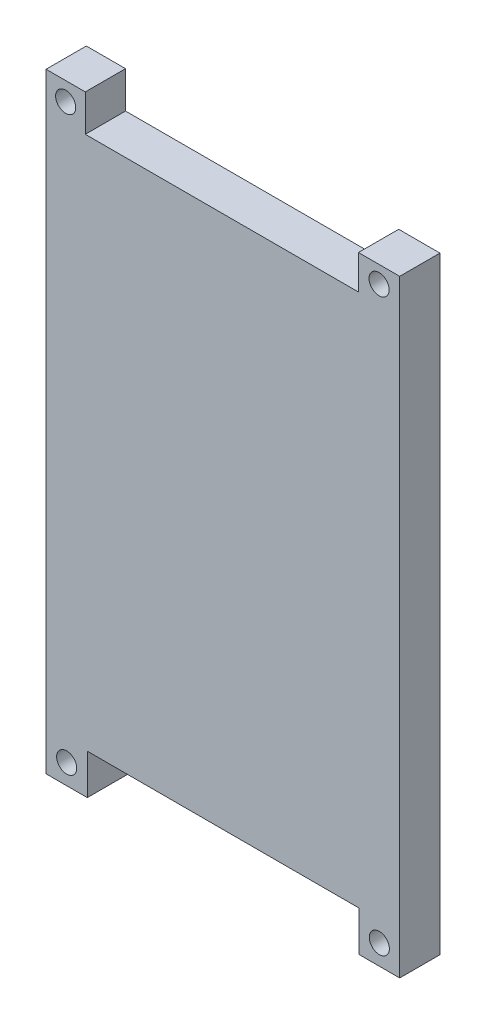
ISO-10303-21;
HEADER;
FILE_DESCRIPTION(('STEP AP214'),'2;1');
FILE_NAME('part.step','',(''),(''),'','','');
FILE_SCHEMA(('AUTOMOTIVE_DESIGN { 1 0 10303 214 1 1 1 1 }'));
ENDSEC;
DATA;
#1=APPLICATION_CONTEXT('core data for automotive mechanical design processes');
#2=APPLICATION_PROTOCOL_DEFINITION('international standard','automotive_design',2000,#1);
#3=PRODUCT_CONTEXT('',#1,'mechanical');
#4=PRODUCT('Part','Part','',(#3));
#5=PRODUCT_RELATED_PRODUCT_CATEGORY('part','',(#4));
#6=PRODUCT_DEFINITION_FORMATION('','',#4);
#7=PRODUCT_DEFINITION_CONTEXT('part definition',#1,'design');
#8=PRODUCT_DEFINITION('design','',#6,#7);
#9=PRODUCT_DEFINITION_SHAPE('','',#8);
#10=(LENGTH_UNIT() NAMED_UNIT(*) SI_UNIT(.MILLI.,.METRE.));
#11=(NAMED_UNIT(*) PLANE_ANGLE_UNIT() SI_UNIT($,.RADIAN.));
#12=(NAMED_UNIT(*) SI_UNIT($,.STERADIAN.) SOLID_ANGLE_UNIT());
#13=UNCERTAINTY_MEASURE_WITH_UNIT(LENGTH_MEASURE(1.E-05),#10,'distance_accuracy_value','');
#14=(GEOMETRIC_REPRESENTATION_CONTEXT(3) GLOBAL_UNCERTAINTY_ASSIGNED_CONTEXT((#13)) GLOBAL_UNIT_ASSIGNED_CONTEXT((#10,
#11,#12)) REPRESENTATION_CONTEXT('',''));
#15=CARTESIAN_POINT('',(0.,0.,0.));
#16=DIRECTION('',(0.,0.,1.));
#17=DIRECTION('',(1.,0.,0.));
#18=AXIS2_PLACEMENT_3D('',#15,#16,#17);
#19=CARTESIAN_POINT('',(31.05,56.4,8.));
#20=DIRECTION('',(0.,0.,-1.));
#21=DIRECTION('',(-1.,0.,0.));
#22=AXIS2_PLACEMENT_3D('',#19,#20,#21);
#23=CYLINDRICAL_SURFACE('',#22,2.);
#24=CARTESIAN_POINT('',(31.05,56.4,8.));
#25=DIRECTION('',(0.,0.,1.));
#26=DIRECTION('',(1.,0.,0.));
#27=AXIS2_PLACEMENT_3D('',#24,#25,#26);
#28=CIRCLE('',#27,2.);
#29=CARTESIAN_POINT('',(33.05,56.4,8.));
#30=VERTEX_POINT('',#29);
#31=EDGE_CURVE('E258',#30,#30,#28,.T.);
#32=ORIENTED_EDGE('',*,*,#31,.T.);
#33=EDGE_LOOP('',(#32));
#34=FACE_BOUND('',#33,.T.);
#35=CARTESIAN_POINT('',(31.05,56.4,0.));
#36=DIRECTION('',(0.,0.,1.));
#37=DIRECTION('',(1.,0.,0.));
#38=AXIS2_PLACEMENT_3D('',#35,#36,#37);
#39=CIRCLE('',#38,2.);
#40=CARTESIAN_POINT('',(33.05,56.4,0.));
#41=VERTEX_POINT('',#40);
#42=EDGE_CURVE('E259',#41,#41,#39,.T.);
#43=ORIENTED_EDGE('',*,*,#42,.F.);
#44=EDGE_LOOP('',(#43));
#45=FACE_BOUND('',#44,.T.);
#46=ADVANCED_FACE('F137',(#34,#45),#23,.F.);
#47=CARTESIAN_POINT('',(-31.05,-57.,8.));
#48=DIRECTION('',(0.,0.,-1.));
#49=DIRECTION('',(-1.,0.,0.));
#50=AXIS2_PLACEMENT_3D('',#47,#48,#49);
#51=CYLINDRICAL_SURFACE('',#50,2.);
#52=CARTESIAN_POINT('',(-31.05,-57.,8.));
#53=DIRECTION('',(0.,0.,1.));
#54=DIRECTION('',(1.,0.,0.));
#55=AXIS2_PLACEMENT_3D('',#52,#53,#54);
#56=CIRCLE('',#55,2.);
#57=CARTESIAN_POINT('',(-29.05,-57.,8.));
#58=VERTEX_POINT('',#57);
#59=EDGE_CURVE('E306',#58,#58,#56,.T.);
#60=ORIENTED_EDGE('',*,*,#59,.T.);
#61=EDGE_LOOP('',(#60));
#62=FACE_BOUND('',#61,.T.);
#63=CARTESIAN_POINT('',(-31.05,-57.,0.));
#64=DIRECTION('',(0.,0.,1.));
#65=DIRECTION('',(1.,0.,0.));
#66=AXIS2_PLACEMENT_3D('',#63,#64,#65);
#67=CIRCLE('',#66,2.);
#68=CARTESIAN_POINT('',(-29.05,-57.,0.));
#69=VERTEX_POINT('',#68);
#70=EDGE_CURVE('E264',#69,#69,#67,.T.);
#71=ORIENTED_EDGE('',*,*,#70,.F.);
#72=EDGE_LOOP('',(#71));
#73=FACE_BOUND('',#72,.T.);
#74=ADVANCED_FACE('F438',(#62,#73),#51,.F.);
#75=CARTESIAN_POINT('',(31.1,-57.,8.));
#76=DIRECTION('',(0.,0.,-1.));
#77=DIRECTION('',(-1.,0.,0.));
#78=AXIS2_PLACEMENT_3D('',#75,#76,#77);
#79=CYLINDRICAL_SURFACE('',#78,2.);
#80=CARTESIAN_POINT('',(31.1,-57.,8.));
#81=DIRECTION('',(0.,0.,1.));
#82=DIRECTION('',(1.,0.,0.));
#83=AXIS2_PLACEMENT_3D('',#80,#81,#82);
#84=CIRCLE('',#83,2.);
#85=CARTESIAN_POINT('',(33.1,-57.,8.));
#86=VERTEX_POINT('',#85);
#87=EDGE_CURVE('E310',#86,#86,#84,.T.);
#88=ORIENTED_EDGE('',*,*,#87,.T.);
#89=EDGE_LOOP('',(#88));
#90=FACE_BOUND('',#89,.T.);
#91=CARTESIAN_POINT('',(31.1,-57.,0.));
#92=DIRECTION('',(0.,0.,1.));
#93=DIRECTION('',(1.,0.,0.));
#94=AXIS2_PLACEMENT_3D('',#91,#92,#93);
#95=CIRCLE('',#94,2.);
#96=CARTESIAN_POINT('',(33.1,-57.,0.));
#97=VERTEX_POINT('',#96);
#98=EDGE_CURVE('E268',#97,#97,#95,.T.);
#99=ORIENTED_EDGE('',*,*,#98,.F.);
#100=EDGE_LOOP('',(#99));
#101=FACE_BOUND('',#100,.T.);
#102=ADVANCED_FACE('F444',(#90,#101),#79,.F.);
#103=CARTESIAN_POINT('',(0.,59.8,8.));
#104=DIRECTION('',(0.,-1.,0.));
#105=DIRECTION('',(1.,0.,0.));
#106=AXIS2_PLACEMENT_3D('',#103,#104,#105);
#107=PLANE('',#106);
#108=DIRECTION('',(-1.,0.,0.));
#109=VECTOR('',#108,1.);
#110=CARTESIAN_POINT('',(0.,59.8,0.));
#111=LINE('',#110,#109);
#112=CARTESIAN_POINT('',(35.15,59.8,0.));
#113=VERTEX_POINT('',#112);
#114=CARTESIAN_POINT('',(26.95,59.8,0.));
#115=VERTEX_POINT('',#114);
#116=EDGE_CURVE('E296',#113,#115,#111,.T.);
#117=ORIENTED_EDGE('',*,*,#116,.T.);
#118=DIRECTION('',(0.,0.,-1.));
#119=VECTOR('',#118,1.);
#120=CARTESIAN_POINT('',(26.95,59.8,8.));
#121=LINE('',#120,#119);
#122=CARTESIAN_POINT('',(26.95,59.8,8.));
#123=VERTEX_POINT('',#122);
#124=EDGE_CURVE('E227',#123,#115,#121,.T.);
#125=ORIENTED_EDGE('',*,*,#124,.F.);
#126=DIRECTION('',(-1.,0.,0.));
#127=VECTOR('',#126,1.);
#128=CARTESIAN_POINT('',(0.,59.8,8.));
#129=LINE('',#128,#127);
#130=CARTESIAN_POINT('',(35.15,59.8,8.));
#131=VERTEX_POINT('',#130);
#132=EDGE_CURVE('E343',#131,#123,#129,.T.);
#133=ORIENTED_EDGE('',*,*,#132,.F.);
#134=DIRECTION('',(0.,0.,-1.));
#135=VECTOR('',#134,1.);
#136=CARTESIAN_POINT('',(35.15,59.8,8.));
#137=LINE('',#136,#135);
#138=EDGE_CURVE('E148',#131,#113,#137,.T.);
#139=ORIENTED_EDGE('',*,*,#138,.T.);
#140=EDGE_LOOP('',(#117,#125,#133,#139));
#141=FACE_BOUND('',#140,.T.);
#142=ADVANCED_FACE('F418',(#141),#107,.F.);
#143=CARTESIAN_POINT('',(26.95,0.,8.));
#144=DIRECTION('',(-1.,0.,0.));
#145=DIRECTION('',(0.,0.,1.));
#146=AXIS2_PLACEMENT_3D('',#143,#144,#145);
#147=PLANE('',#146);
#148=DIRECTION('',(0.,1.,0.));
#149=VECTOR('',#148,1.);
#150=CARTESIAN_POINT('',(26.95,0.,0.));
#151=LINE('',#150,#149);
#152=CARTESIAN_POINT('',(26.95,53.,0.));
#153=VERTEX_POINT('',#152);
#154=EDGE_CURVE('E292',#153,#115,#151,.T.);
#155=ORIENTED_EDGE('',*,*,#154,.F.);
#156=DIRECTION('',(0.,0.,-1.));
#157=VECTOR('',#156,1.);
#158=CARTESIAN_POINT('',(26.95,53.,8.));
#159=LINE('',#158,#157);
#160=CARTESIAN_POINT('',(26.95,53.,8.));
#161=VERTEX_POINT('',#160);
#162=EDGE_CURVE('E231',#161,#153,#159,.T.);
#163=ORIENTED_EDGE('',*,*,#162,.F.);
#164=DIRECTION('',(0.,1.,0.));
#165=VECTOR('',#164,1.);
#166=CARTESIAN_POINT('',(26.95,0.,8.));
#167=LINE('',#166,#165);
#168=EDGE_CURVE('E339',#161,#123,#167,.T.);
#169=ORIENTED_EDGE('',*,*,#168,.T.);
#170=ORIENTED_EDGE('',*,*,#124,.T.);
#171=EDGE_LOOP('',(#155,#163,#169,#170));
#172=FACE_BOUND('',#171,.T.);
#173=ADVANCED_FACE('F423',(#172),#147,.T.);
#174=CARTESIAN_POINT('',(0.,53.,8.));
#175=DIRECTION('',(0.,1.,0.));
#176=DIRECTION('',(0.,0.,1.));
#177=AXIS2_PLACEMENT_3D('',#174,#175,#176);
#178=PLANE('',#177);
#179=DIRECTION('',(1.,0.,0.));
#180=VECTOR('',#179,1.);
#181=CARTESIAN_POINT('',(0.,53.,0.));
#182=LINE('',#181,#180);
#183=CARTESIAN_POINT('',(-27.35,53.,0.));
#184=VERTEX_POINT('',#183);
#185=EDGE_CURVE('E194',#184,#153,#182,.T.);
#186=ORIENTED_EDGE('',*,*,#185,.F.);
#187=DIRECTION('',(0.,0.,1.));
#188=VECTOR('',#187,1.);
#189=CARTESIAN_POINT('',(-27.35,53.,8.));
#190=LINE('',#189,#188);
#191=CARTESIAN_POINT('',(-27.35,53.,8.));
#192=VERTEX_POINT('',#191);
#193=EDGE_CURVE('E12',#184,#192,#190,.T.);
#194=ORIENTED_EDGE('',*,*,#193,.T.);
#195=DIRECTION('',(1.,0.,0.));
#196=VECTOR('',#195,1.);
#197=CARTESIAN_POINT('',(0.,53.,8.));
#198=LINE('',#197,#196);
#199=EDGE_CURVE('E336',#192,#161,#198,.T.);
#200=ORIENTED_EDGE('',*,*,#199,.T.);
#201=ORIENTED_EDGE('',*,*,#162,.T.);
#202=EDGE_LOOP('',(#186,#194,#200,#201));
#203=FACE_BOUND('',#202,.T.);
#204=ADVANCED_FACE('F424',(#203),#178,.T.);
#205=CARTESIAN_POINT('',(-35.15,0.,8.));
#206=DIRECTION('',(1.,0.,0.));
#207=DIRECTION('',(0.,1.,0.));
#208=AXIS2_PLACEMENT_3D('',#205,#206,#207);
#209=PLANE('',#208);
#210=DIRECTION('',(0.,-1.,0.));
#211=VECTOR('',#210,1.);
#212=CARTESIAN_POINT('',(-35.15,0.,0.));
#213=LINE('',#212,#211);
#214=CARTESIAN_POINT('',(-35.15,60.3,0.));
#215=VERTEX_POINT('',#214);
#216=CARTESIAN_POINT('',(-35.15,-61.,0.));
#217=VERTEX_POINT('',#216);
#218=EDGE_CURVE('E179',#215,#217,#213,.T.);
#219=ORIENTED_EDGE('',*,*,#218,.T.);
#220=DIRECTION('',(0.,0.,-1.));
#221=VECTOR('',#220,1.);
#222=CARTESIAN_POINT('',(-35.15,-61.,8.));
#223=LINE('',#222,#221);
#224=CARTESIAN_POINT('',(-35.15,-61.,8.));
#225=VERTEX_POINT('',#224);
#226=EDGE_CURVE('E235',#225,#217,#223,.T.);
#227=ORIENTED_EDGE('',*,*,#226,.F.);
#228=DIRECTION('',(0.,-1.,0.));
#229=VECTOR('',#228,1.);
#230=CARTESIAN_POINT('',(-35.15,0.,8.));
#231=LINE('',#230,#229);
#232=CARTESIAN_POINT('',(-35.15,60.3,8.));
#233=VERTEX_POINT('',#232);
#234=EDGE_CURVE('E200',#233,#225,#231,.T.);
#235=ORIENTED_EDGE('',*,*,#234,.F.);
#236=DIRECTION('',(0.,0.,-1.));
#237=VECTOR('',#236,1.);
#238=CARTESIAN_POINT('',(-35.15,60.3,8.));
#239=LINE('',#238,#237);
#240=EDGE_CURVE('E197',#233,#215,#239,.T.);
#241=ORIENTED_EDGE('',*,*,#240,.T.);
#242=EDGE_LOOP('',(#219,#227,#235,#241));
#243=FACE_BOUND('',#242,.T.);
#244=ADVANCED_FACE('F198',(#243),#209,.F.);
#245=CARTESIAN_POINT('',(0.,-61.,8.));
#246=DIRECTION('',(0.,1.,0.));
#247=DIRECTION('',(0.,0.,1.));
#248=AXIS2_PLACEMENT_3D('',#245,#246,#247);
#249=PLANE('',#248);
#250=DIRECTION('',(1.,0.,0.));
#251=VECTOR('',#250,1.);
#252=CARTESIAN_POINT('',(0.,-61.,0.));
#253=LINE('',#252,#251);
#254=CARTESIAN_POINT('',(-26.95,-61.,0.));
#255=VERTEX_POINT('',#254);
#256=EDGE_CURVE('E189',#217,#255,#253,.T.);
#257=ORIENTED_EDGE('',*,*,#256,.T.);
#258=DIRECTION('',(0.,0.,-1.));
#259=VECTOR('',#258,1.);
#260=CARTESIAN_POINT('',(-26.95,-61.,8.));
#261=LINE('',#260,#259);
#262=CARTESIAN_POINT('',(-26.95,-61.,8.));
#263=VERTEX_POINT('',#262);
#264=EDGE_CURVE('E238',#263,#255,#261,.T.);
#265=ORIENTED_EDGE('',*,*,#264,.F.);
#266=DIRECTION('',(1.,0.,0.));
#267=VECTOR('',#266,1.);
#268=CARTESIAN_POINT('',(0.,-61.,8.));
#269=LINE('',#268,#267);
#270=EDGE_CURVE('E330',#225,#263,#269,.T.);
#271=ORIENTED_EDGE('',*,*,#270,.F.);
#272=ORIENTED_EDGE('',*,*,#226,.T.);
#273=EDGE_LOOP('',(#257,#265,#271,#272));
#274=FACE_BOUND('',#273,.T.);
#275=ADVANCED_FACE('F410',(#274),#249,.F.);
#276=CARTESIAN_POINT('',(-26.95,0.,8.));
#277=DIRECTION('',(1.,0.,0.));
#278=DIRECTION('',(0.,0.,-1.));
#279=AXIS2_PLACEMENT_3D('',#276,#277,#278);
#280=PLANE('',#279);
#281=DIRECTION('',(0.,-1.,0.));
#282=VECTOR('',#281,1.);
#283=CARTESIAN_POINT('',(-26.95,0.,0.));
#284=LINE('',#283,#282);
#285=CARTESIAN_POINT('',(-26.95,-53.,0.));
#286=VERTEX_POINT('',#285);
#287=EDGE_CURVE('E284',#286,#255,#284,.T.);
#288=ORIENTED_EDGE('',*,*,#287,.F.);
#289=DIRECTION('',(0.,0.,-1.));
#290=VECTOR('',#289,1.);
#291=CARTESIAN_POINT('',(-26.95,-53.,8.));
#292=LINE('',#291,#290);
#293=CARTESIAN_POINT('',(-26.95,-53.,8.));
#294=VERTEX_POINT('',#293);
#295=EDGE_CURVE('E242',#294,#286,#292,.T.);
#296=ORIENTED_EDGE('',*,*,#295,.F.);
#297=DIRECTION('',(0.,-1.,0.));
#298=VECTOR('',#297,1.);
#299=CARTESIAN_POINT('',(-26.95,0.,8.));
#300=LINE('',#299,#298);
#301=EDGE_CURVE('E326',#294,#263,#300,.T.);
#302=ORIENTED_EDGE('',*,*,#301,.T.);
#303=ORIENTED_EDGE('',*,*,#264,.T.);
#304=EDGE_LOOP('',(#288,#296,#302,#303));
#305=FACE_BOUND('',#304,.T.);
#306=ADVANCED_FACE('F401',(#305),#280,.T.);
#307=CARTESIAN_POINT('',(0.,-53.,8.));
#308=DIRECTION('',(0.,1.,0.));
#309=DIRECTION('',(0.,0.,1.));
#310=AXIS2_PLACEMENT_3D('',#307,#308,#309);
#311=PLANE('',#310);
#312=DIRECTION('',(1.,0.,0.));
#313=VECTOR('',#312,1.);
#314=CARTESIAN_POINT('',(0.,-53.,0.));
#315=LINE('',#314,#313);
#316=CARTESIAN_POINT('',(27.05,-53.,0.));
#317=VERTEX_POINT('',#316);
#318=EDGE_CURVE('E280',#286,#317,#315,.T.);
#319=ORIENTED_EDGE('',*,*,#318,.T.);
#320=DIRECTION('',(0.,0.,-1.));
#321=VECTOR('',#320,1.);
#322=CARTESIAN_POINT('',(27.05,-53.,8.));
#323=LINE('',#322,#321);
#324=CARTESIAN_POINT('',(27.05,-53.,8.));
#325=VERTEX_POINT('',#324);
#326=EDGE_CURVE('E246',#325,#317,#323,.T.);
#327=ORIENTED_EDGE('',*,*,#326,.F.);
#328=DIRECTION('',(1.,0.,0.));
#329=VECTOR('',#328,1.);
#330=CARTESIAN_POINT('',(0.,-53.,8.));
#331=LINE('',#330,#329);
#332=EDGE_CURVE('E322',#294,#325,#331,.T.);
#333=ORIENTED_EDGE('',*,*,#332,.F.);
#334=ORIENTED_EDGE('',*,*,#295,.T.);
#335=EDGE_LOOP('',(#319,#327,#333,#334));
#336=FACE_BOUND('',#335,.T.);
#337=ADVANCED_FACE('F406',(#336),#311,.F.);
#338=CARTESIAN_POINT('',(27.05,0.,8.));
#339=DIRECTION('',(1.,0.,0.));
#340=DIRECTION('',(0.,0.,-1.));
#341=AXIS2_PLACEMENT_3D('',#338,#339,#340);
#342=PLANE('',#341);
#343=DIRECTION('',(0.,-1.,0.));
#344=VECTOR('',#343,1.);
#345=CARTESIAN_POINT('',(27.05,0.,0.));
#346=LINE('',#345,#344);
#347=CARTESIAN_POINT('',(27.05,-61.,0.));
#348=VERTEX_POINT('',#347);
#349=EDGE_CURVE('E276',#317,#348,#346,.T.);
#350=ORIENTED_EDGE('',*,*,#349,.T.);
#351=DIRECTION('',(0.,0.,-1.));
#352=VECTOR('',#351,1.);
#353=CARTESIAN_POINT('',(27.05,-61.,8.));
#354=LINE('',#353,#352);
#355=CARTESIAN_POINT('',(27.05,-61.,8.));
#356=VERTEX_POINT('',#355);
#357=EDGE_CURVE('E250',#356,#348,#354,.T.);
#358=ORIENTED_EDGE('',*,*,#357,.F.);
#359=DIRECTION('',(0.,-1.,0.));
#360=VECTOR('',#359,1.);
#361=CARTESIAN_POINT('',(27.05,0.,8.));
#362=LINE('',#361,#360);
#363=EDGE_CURVE('E318',#325,#356,#362,.T.);
#364=ORIENTED_EDGE('',*,*,#363,.F.);
#365=ORIENTED_EDGE('',*,*,#326,.T.);
#366=EDGE_LOOP('',(#350,#358,#364,#365));
#367=FACE_BOUND('',#366,.T.);
#368=ADVANCED_FACE('F413',(#367),#342,.F.);
#369=CARTESIAN_POINT('',(0.,-61.,8.));
#370=DIRECTION('',(0.,-1.,0.));
#371=DIRECTION('',(0.,0.,-1.));
#372=AXIS2_PLACEMENT_3D('',#369,#370,#371);
#373=PLANE('',#372);
#374=DIRECTION('',(-1.,0.,0.));
#375=VECTOR('',#374,1.);
#376=CARTESIAN_POINT('',(0.,-61.,0.));
#377=LINE('',#376,#375);
#378=CARTESIAN_POINT('',(35.15,-61.,0.));
#379=VERTEX_POINT('',#378);
#380=EDGE_CURVE('E272',#379,#348,#377,.T.);
#381=ORIENTED_EDGE('',*,*,#380,.F.);
#382=DIRECTION('',(0.,0.,-1.));
#383=VECTOR('',#382,1.);
#384=CARTESIAN_POINT('',(35.15,-61.,8.));
#385=LINE('',#384,#383);
#386=CARTESIAN_POINT('',(35.15,-61.,8.));
#387=VERTEX_POINT('',#386);
#388=EDGE_CURVE('E254',#387,#379,#385,.T.);
#389=ORIENTED_EDGE('',*,*,#388,.F.);
#390=DIRECTION('',(-1.,0.,0.));
#391=VECTOR('',#390,1.);
#392=CARTESIAN_POINT('',(0.,-61.,8.));
#393=LINE('',#392,#391);
#394=EDGE_CURVE('E314',#387,#356,#393,.T.);
#395=ORIENTED_EDGE('',*,*,#394,.T.);
#396=ORIENTED_EDGE('',*,*,#357,.T.);
#397=EDGE_LOOP('',(#381,#389,#395,#396));
#398=FACE_BOUND('',#397,.T.);
#399=ADVANCED_FACE('F368',(#398),#373,.T.);
#400=CARTESIAN_POINT('',(35.15,0.,8.));
#401=DIRECTION('',(1.,0.,0.));
#402=DIRECTION('',(0.,1.,0.));
#403=AXIS2_PLACEMENT_3D('',#400,#401,#402);
#404=PLANE('',#403);
#405=DIRECTION('',(0.,-1.,0.));
#406=VECTOR('',#405,1.);
#407=CARTESIAN_POINT('',(35.15,0.,0.));
#408=LINE('',#407,#406);
#409=EDGE_CURVE('E300',#113,#379,#408,.T.);
#410=ORIENTED_EDGE('',*,*,#409,.F.);
#411=ORIENTED_EDGE('',*,*,#138,.F.);
#412=DIRECTION('',(0.,-1.,0.));
#413=VECTOR('',#412,1.);
#414=CARTESIAN_POINT('',(35.15,0.,8.));
#415=LINE('',#414,#413);
#416=EDGE_CURVE('E263',#131,#387,#415,.T.);
#417=ORIENTED_EDGE('',*,*,#416,.T.);
#418=ORIENTED_EDGE('',*,*,#388,.T.);
#419=EDGE_LOOP('',(#410,#411,#417,#418));
#420=FACE_BOUND('',#419,.T.);
#421=ADVANCED_FACE('F354',(#420),#404,.T.);
#422=CARTESIAN_POINT('',(0.,0.,0.));
#423=DIRECTION('',(0.,0.,1.));
#424=DIRECTION('',(1.,0.,0.));
#425=AXIS2_PLACEMENT_3D('',#422,#423,#424);
#426=PLANE('',#425);
#427=ORIENTED_EDGE('',*,*,#409,.T.);
#428=ORIENTED_EDGE('',*,*,#380,.T.);
#429=ORIENTED_EDGE('',*,*,#349,.F.);
#430=ORIENTED_EDGE('',*,*,#318,.F.);
#431=ORIENTED_EDGE('',*,*,#287,.T.);
#432=ORIENTED_EDGE('',*,*,#256,.F.);
#433=ORIENTED_EDGE('',*,*,#218,.F.);
#434=DIRECTION('',(1.,0.,0.));
#435=VECTOR('',#434,1.);
#436=CARTESIAN_POINT('',(-35.15,60.3,0.));
#437=LINE('',#436,#435);
#438=CARTESIAN_POINT('',(-27.35,60.3,0.));
#439=VERTEX_POINT('',#438);
#440=EDGE_CURVE('E185',#215,#439,#437,.T.);
#441=ORIENTED_EDGE('',*,*,#440,.T.);
#442=DIRECTION('',(0.,1.,0.));
#443=VECTOR('',#442,1.);
#444=CARTESIAN_POINT('',(-27.35,53.,0.));
#445=LINE('',#444,#443);
#446=EDGE_CURVE('E207',#184,#439,#445,.T.);
#447=ORIENTED_EDGE('',*,*,#446,.F.);
#448=ORIENTED_EDGE('',*,*,#185,.T.);
#449=ORIENTED_EDGE('',*,*,#154,.T.);
#450=ORIENTED_EDGE('',*,*,#116,.F.);
#451=EDGE_LOOP('',(#427,#428,#429,#430,#431,#432,#433,#441,#447,#448,#449,#450));
#452=FACE_BOUND('',#451,.T.);
#453=ORIENTED_EDGE('',*,*,#98,.T.);
#454=EDGE_LOOP('',(#453));
#455=FACE_BOUND('',#454,.T.);
#456=ORIENTED_EDGE('',*,*,#70,.T.);
#457=EDGE_LOOP('',(#456));
#458=FACE_BOUND('',#457,.T.);
#459=ORIENTED_EDGE('',*,*,#42,.T.);
#460=EDGE_LOOP('',(#459));
#461=FACE_BOUND('',#460,.T.);
#462=CARTESIAN_POINT('',(-31.25,56.65,0.));
#463=DIRECTION('',(0.,0.,1.));
#464=DIRECTION('',(1.,0.,0.));
#465=AXIS2_PLACEMENT_3D('',#462,#463,#464);
#466=CIRCLE('',#465,2.);
#467=CARTESIAN_POINT('',(-29.25,56.65,0.));
#468=VERTEX_POINT('',#467);
#469=EDGE_CURVE('E217',#468,#468,#466,.T.);
#470=ORIENTED_EDGE('',*,*,#469,.T.);
#471=EDGE_LOOP('',(#470));
#472=FACE_BOUND('',#471,.T.);
#473=ADVANCED_FACE('F182',(#452,#455,#458,#461,#472),#426,.F.);
#474=CARTESIAN_POINT('',(0.,0.,8.));
#475=DIRECTION('',(0.,0.,1.));
#476=DIRECTION('',(1.,0.,0.));
#477=AXIS2_PLACEMENT_3D('',#474,#475,#476);
#478=PLANE('',#477);
#479=ORIENTED_EDGE('',*,*,#416,.F.);
#480=ORIENTED_EDGE('',*,*,#132,.T.);
#481=ORIENTED_EDGE('',*,*,#168,.F.);
#482=ORIENTED_EDGE('',*,*,#199,.F.);
#483=DIRECTION('',(0.,1.,0.));
#484=VECTOR('',#483,1.);
#485=CARTESIAN_POINT('',(-27.35,53.,8.));
#486=LINE('',#485,#484);
#487=CARTESIAN_POINT('',(-27.35,60.3,8.));
#488=VERTEX_POINT('',#487);
#489=EDGE_CURVE('E206',#192,#488,#486,.T.);
#490=ORIENTED_EDGE('',*,*,#489,.T.);
#491=DIRECTION('',(1.,0.,0.));
#492=VECTOR('',#491,1.);
#493=CARTESIAN_POINT('',(-35.15,60.3,8.));
#494=LINE('',#493,#492);
#495=EDGE_CURVE('E203',#233,#488,#494,.T.);
#496=ORIENTED_EDGE('',*,*,#495,.F.);
#497=ORIENTED_EDGE('',*,*,#234,.T.);
#498=ORIENTED_EDGE('',*,*,#270,.T.);
#499=ORIENTED_EDGE('',*,*,#301,.F.);
#500=ORIENTED_EDGE('',*,*,#332,.T.);
#501=ORIENTED_EDGE('',*,*,#363,.T.);
#502=ORIENTED_EDGE('',*,*,#394,.F.);
#503=EDGE_LOOP('',(#479,#480,#481,#482,#490,#496,#497,#498,#499,#500,#501,#502));
#504=FACE_BOUND('',#503,.T.);
#505=ORIENTED_EDGE('',*,*,#87,.F.);
#506=EDGE_LOOP('',(#505));
#507=FACE_BOUND('',#506,.T.);
#508=ORIENTED_EDGE('',*,*,#59,.F.);
#509=EDGE_LOOP('',(#508));
#510=FACE_BOUND('',#509,.T.);
#511=ORIENTED_EDGE('',*,*,#31,.F.);
#512=EDGE_LOOP('',(#511));
#513=FACE_BOUND('',#512,.T.);
#514=CARTESIAN_POINT('',(-31.25,56.65,8.));
#515=DIRECTION('',(0.,0.,1.));
#516=DIRECTION('',(1.,0.,0.));
#517=AXIS2_PLACEMENT_3D('',#514,#515,#516);
#518=CIRCLE('',#517,2.);
#519=CARTESIAN_POINT('',(-29.25,56.65,8.));
#520=VERTEX_POINT('',#519);
#521=EDGE_CURVE('E212',#520,#520,#518,.T.);
#522=ORIENTED_EDGE('',*,*,#521,.F.);
#523=EDGE_LOOP('',(#522));
#524=FACE_BOUND('',#523,.T.);
#525=ADVANCED_FACE('F362',(#504,#507,#510,#513,#524),#478,.T.);
#526=CARTESIAN_POINT('',(-31.25,56.65,8.));
#527=DIRECTION('',(0.,0.,-1.));
#528=DIRECTION('',(-1.,0.,0.));
#529=AXIS2_PLACEMENT_3D('',#526,#527,#528);
#530=CYLINDRICAL_SURFACE('',#529,2.);
#531=ORIENTED_EDGE('',*,*,#521,.T.);
#532=EDGE_LOOP('',(#531));
#533=FACE_BOUND('',#532,.T.);
#534=ORIENTED_EDGE('',*,*,#469,.F.);
#535=EDGE_LOOP('',(#534));
#536=FACE_BOUND('',#535,.T.);
#537=ADVANCED_FACE('F428',(#533,#536),#530,.F.);
#538=CARTESIAN_POINT('',(-27.35,53.,8.));
#539=DIRECTION('',(-1.,0.,0.));
#540=DIRECTION('',(0.,0.,1.));
#541=AXIS2_PLACEMENT_3D('',#538,#539,#540);
#542=PLANE('',#541);
#543=ORIENTED_EDGE('',*,*,#446,.T.);
#544=DIRECTION('',(0.,0.,-1.));
#545=VECTOR('',#544,1.);
#546=CARTESIAN_POINT('',(-27.35,60.3,8.));
#547=LINE('',#546,#545);
#548=EDGE_CURVE('E141',#488,#439,#547,.T.);
#549=ORIENTED_EDGE('',*,*,#548,.F.);
#550=ORIENTED_EDGE('',*,*,#489,.F.);
#551=ORIENTED_EDGE('',*,*,#193,.F.);
#552=EDGE_LOOP('',(#543,#549,#550,#551));
#553=FACE_BOUND('',#552,.T.);
#554=ADVANCED_FACE('F139',(#553),#542,.F.);
#555=CARTESIAN_POINT('',(-35.15,60.3,8.));
#556=DIRECTION('',(0.,1.,0.));
#557=DIRECTION('',(0.,0.,1.));
#558=AXIS2_PLACEMENT_3D('',#555,#556,#557);
#559=PLANE('',#558);
#560=ORIENTED_EDGE('',*,*,#440,.F.);
#561=ORIENTED_EDGE('',*,*,#240,.F.);
#562=ORIENTED_EDGE('',*,*,#495,.T.);
#563=ORIENTED_EDGE('',*,*,#548,.T.);
#564=EDGE_LOOP('',(#560,#561,#562,#563));
#565=FACE_BOUND('',#564,.T.);
#566=ADVANCED_FACE('F204',(#565),#559,.T.);
#567=CLOSED_SHELL('',(#46,#74,#102,#142,#173,#204,#244,#275,#306,#337,#368,#399,#421,#473,#525,
#537,#554,#566));
#568=MANIFOLD_SOLID_BREP('B2',#567);
#569=ADVANCED_BREP_SHAPE_REPRESENTATION('',(#18,#568),#14);
#570=SHAPE_DEFINITION_REPRESENTATION(#9,#569);
ENDSEC;
END-ISO-10303-21;
